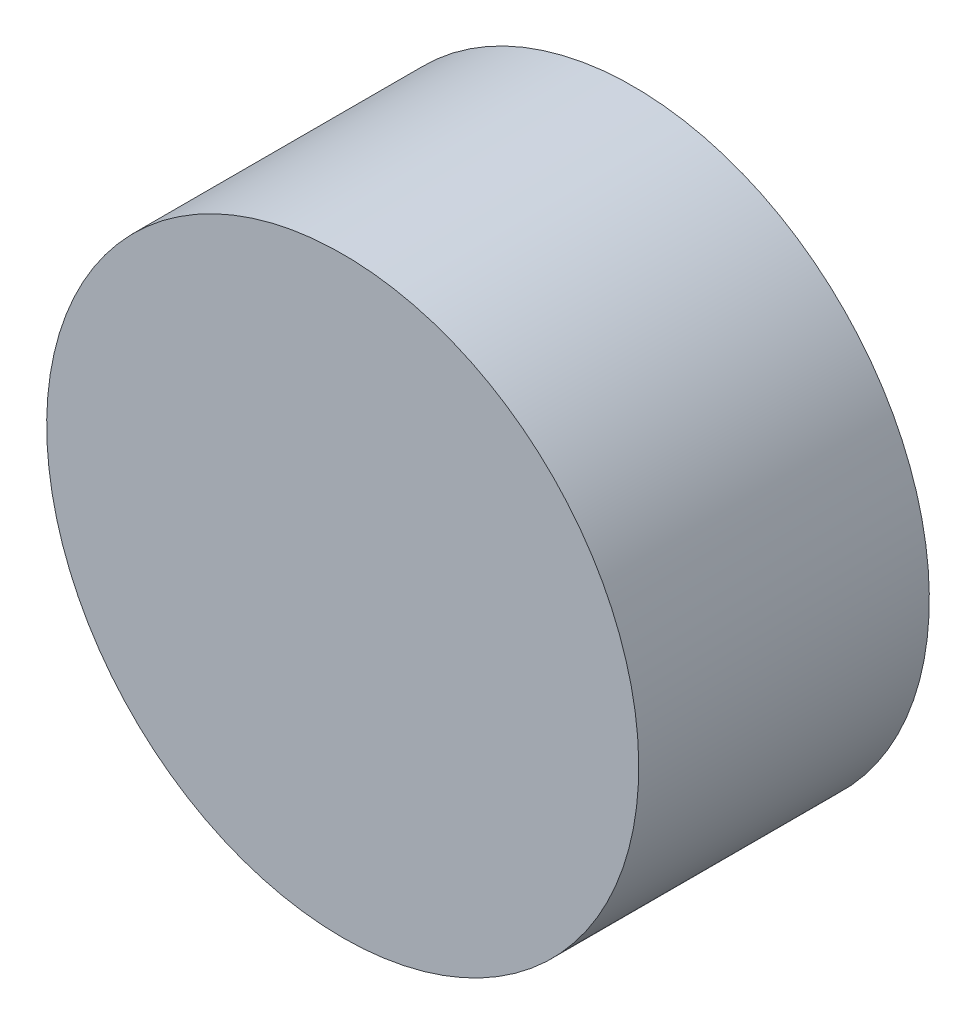
ISO-10303-21;
HEADER;
FILE_DESCRIPTION(('STEP AP214'),'2;1');
FILE_NAME('part.step','',(''),(''),'','','');
FILE_SCHEMA(('AUTOMOTIVE_DESIGN { 1 0 10303 214 1 1 1 1 }'));
ENDSEC;
DATA;
#1=APPLICATION_CONTEXT('core data for automotive mechanical design processes');
#2=APPLICATION_PROTOCOL_DEFINITION('international standard','automotive_design',2000,#1);
#3=PRODUCT_CONTEXT('',#1,'mechanical');
#4=PRODUCT('Part','Part','',(#3));
#5=PRODUCT_RELATED_PRODUCT_CATEGORY('part','',(#4));
#6=PRODUCT_DEFINITION_FORMATION('','',#4);
#7=PRODUCT_DEFINITION_CONTEXT('part definition',#1,'design');
#8=PRODUCT_DEFINITION('design','',#6,#7);
#9=PRODUCT_DEFINITION_SHAPE('','',#8);
#10=(LENGTH_UNIT() NAMED_UNIT(*) SI_UNIT(.MILLI.,.METRE.));
#11=(NAMED_UNIT(*) PLANE_ANGLE_UNIT() SI_UNIT($,.RADIAN.));
#12=(NAMED_UNIT(*) SI_UNIT($,.STERADIAN.) SOLID_ANGLE_UNIT());
#13=UNCERTAINTY_MEASURE_WITH_UNIT(LENGTH_MEASURE(1.E-05),#10,'distance_accuracy_value','');
#14=(GEOMETRIC_REPRESENTATION_CONTEXT(3) GLOBAL_UNCERTAINTY_ASSIGNED_CONTEXT((#13)) GLOBAL_UNIT_ASSIGNED_CONTEXT((#10,
#11,#12)) REPRESENTATION_CONTEXT('',''));
#15=CARTESIAN_POINT('',(0.,0.,0.));
#16=DIRECTION('',(0.,0.,1.));
#17=DIRECTION('',(1.,0.,0.));
#18=AXIS2_PLACEMENT_3D('',#15,#16,#17);
#19=CARTESIAN_POINT('',(0.,-32.8262941296683,1.201765558309E-13));
#20=DIRECTION('',(0.,0.,1.));
#21=DIRECTION('',(0.,-1.,0.));
#22=AXIS2_PLACEMENT_3D('',#19,#20,#21);
#23=PLANE('',#22);
#24=CARTESIAN_POINT('',(0.,0.,-2.403531116618E-13));
#25=DIRECTION('',(0.,0.,1.));
#26=DIRECTION('',(0.,-1.,0.));
#27=AXIS2_PLACEMENT_3D('',#24,#25,#26);
#28=CIRCLE('',#27,32.8262941296683);
#29=CARTESIAN_POINT('',(0.,-32.8262941296683,0.));
#30=VERTEX_POINT('',#29);
#31=EDGE_CURVE('E10',#30,#30,#28,.T.);
#32=ORIENTED_EDGE('',*,*,#31,.T.);
#33=EDGE_LOOP('',(#32));
#34=FACE_BOUND('',#33,.T.);
#35=ADVANCED_FACE('F37',(#34),#23,.T.);
#36=CARTESIAN_POINT('',(0.,0.,0.));
#37=DIRECTION('',(0.,0.,1.));
#38=DIRECTION('',(0.,-1.,0.));
#39=AXIS2_PLACEMENT_3D('',#36,#37,#38);
#40=CYLINDRICAL_SURFACE('',#39,32.8262941296682);
#41=CARTESIAN_POINT('',(0.,-2.35922392732847E-13,-32.2211674401819));
#42=DIRECTION('',(0.,0.,1.));
#43=DIRECTION('',(0.,-1.,0.));
#44=AXIS2_PLACEMENT_3D('',#41,#42,#43);
#45=CIRCLE('',#44,32.8262941296681);
#46=CARTESIAN_POINT('',(0.,-32.8262941296683,-32.2211674401816));
#47=VERTEX_POINT('',#46);
#48=EDGE_CURVE('E43',#47,#47,#45,.T.);
#49=ORIENTED_EDGE('',*,*,#48,.T.);
#50=EDGE_LOOP('',(#49));
#51=FACE_BOUND('',#50,.T.);
#52=ORIENTED_EDGE('',*,*,#31,.F.);
#53=EDGE_LOOP('',(#52));
#54=FACE_BOUND('',#53,.T.);
#55=ADVANCED_FACE('F49',(#51,#54),#40,.T.);
#56=CARTESIAN_POINT('',(0.,-32.8262941296683,-32.2211674401815));
#57=DIRECTION('',(0.,0.,-1.));
#58=DIRECTION('',(0.,1.,0.));
#59=AXIS2_PLACEMENT_3D('',#56,#57,#58);
#60=PLANE('',#59);
#61=ORIENTED_EDGE('',*,*,#48,.F.);
#62=EDGE_LOOP('',(#61));
#63=FACE_BOUND('',#62,.T.);
#64=ADVANCED_FACE('F52',(#63),#60,.T.);
#65=CLOSED_SHELL('',(#35,#55,#64));
#66=MANIFOLD_SOLID_BREP('B2',#65);
#67=ADVANCED_BREP_SHAPE_REPRESENTATION('',(#18,#66),#14);
#68=SHAPE_DEFINITION_REPRESENTATION(#9,#67);
ENDSEC;
END-ISO-10303-21;
